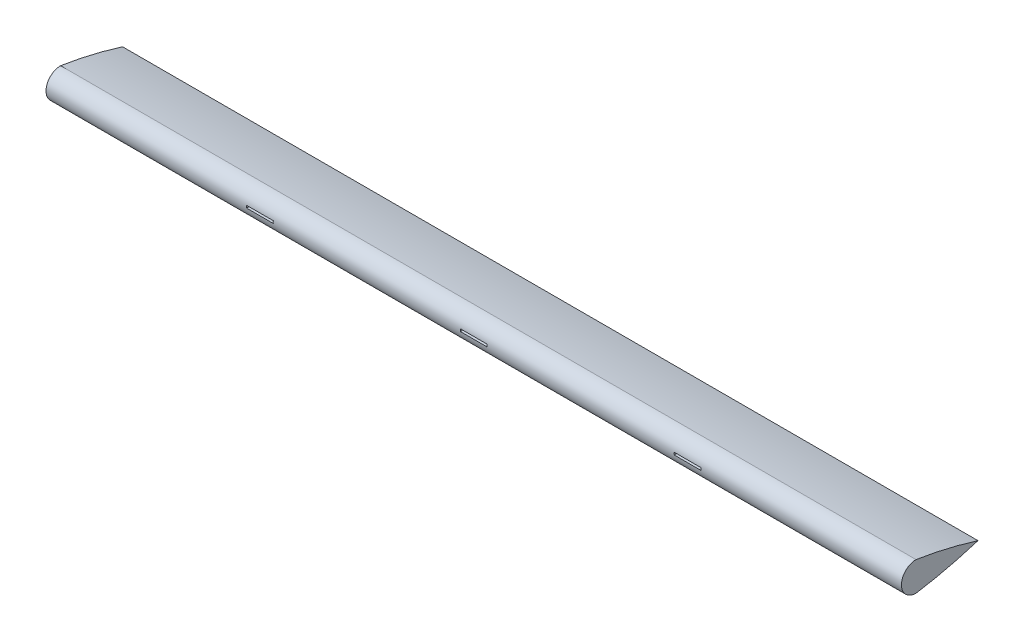
ISO-10303-21;
HEADER;
FILE_DESCRIPTION(('STEP AP214'),'2;1');
FILE_NAME('part.step','',(''),(''),'','','');
FILE_SCHEMA(('AUTOMOTIVE_DESIGN { 1 0 10303 214 1 1 1 1 }'));
ENDSEC;
DATA;
#1=APPLICATION_CONTEXT('core data for automotive mechanical design processes');
#2=APPLICATION_PROTOCOL_DEFINITION('international standard','automotive_design',2000,#1);
#3=PRODUCT_CONTEXT('',#1,'mechanical');
#4=PRODUCT('Part','Part','',(#3));
#5=PRODUCT_RELATED_PRODUCT_CATEGORY('part','',(#4));
#6=PRODUCT_DEFINITION_FORMATION('','',#4);
#7=PRODUCT_DEFINITION_CONTEXT('part definition',#1,'design');
#8=PRODUCT_DEFINITION('design','',#6,#7);
#9=PRODUCT_DEFINITION_SHAPE('','',#8);
#10=(LENGTH_UNIT() NAMED_UNIT(*) SI_UNIT(.MILLI.,.METRE.));
#11=(NAMED_UNIT(*) PLANE_ANGLE_UNIT() SI_UNIT($,.RADIAN.));
#12=(NAMED_UNIT(*) SI_UNIT($,.STERADIAN.) SOLID_ANGLE_UNIT());
#13=UNCERTAINTY_MEASURE_WITH_UNIT(LENGTH_MEASURE(1.E-05),#10,'distance_accuracy_value','');
#14=(GEOMETRIC_REPRESENTATION_CONTEXT(3) GLOBAL_UNCERTAINTY_ASSIGNED_CONTEXT((#13)) GLOBAL_UNIT_ASSIGNED_CONTEXT((#10,
#11,#12)) REPRESENTATION_CONTEXT('',''));
#15=CARTESIAN_POINT('',(0.,0.,0.));
#16=DIRECTION('',(0.,0.,1.));
#17=DIRECTION('',(1.,0.,0.));
#18=AXIS2_PLACEMENT_3D('',#15,#16,#17);
#19=CARTESIAN_POINT('',(-192.917832605124,0.,-3.99999999999997));
#20=DIRECTION('',(1.,0.,0.));
#21=DIRECTION('',(0.,0.,-1.));
#22=AXIS2_PLACEMENT_3D('',#19,#20,#21);
#23=CYLINDRICAL_SURFACE('',#22,6.00000000003809);
#24=CARTESIAN_POINT('',(-5.50000000000001,0.,-3.99999999999997));
#25=DIRECTION('',(1.,0.,0.));
#26=DIRECTION('',(0.,0.,-1.));
#27=AXIS2_PLACEMENT_3D('',#24,#25,#26);
#28=CIRCLE('',#27,6.00000000003809);
#29=CARTESIAN_POINT('',(-5.50000000000001,0.500000000000088,1.97913037158894));
#30=VERTEX_POINT('',#29);
#31=CARTESIAN_POINT('',(-5.50000000000001,-0.499999999999912,1.97913037158895));
#32=VERTEX_POINT('',#31);
#33=EDGE_CURVE('E460',#30,#32,#28,.T.);
#34=ORIENTED_EDGE('',*,*,#33,.F.);
#35=DIRECTION('',(1.,0.,0.));
#36=VECTOR('',#35,1.);
#37=CARTESIAN_POINT('',(-192.917832605124,0.500000000000088,1.97913037158894));
#38=LINE('',#37,#36);
#39=CARTESIAN_POINT('',(5.50000000000001,0.500000000000088,1.97913037158894));
#40=VERTEX_POINT('',#39);
#41=EDGE_CURVE('E458',#40,#30,#38,.F.);
#42=ORIENTED_EDGE('',*,*,#41,.F.);
#43=CARTESIAN_POINT('',(5.50000000000001,0.,-3.99999999999997));
#44=DIRECTION('',(-1.,0.,0.));
#45=DIRECTION('',(0.,0.,1.));
#46=AXIS2_PLACEMENT_3D('',#43,#44,#45);
#47=CIRCLE('',#46,6.00000000003809);
#48=CARTESIAN_POINT('',(5.50000000000001,-0.499999999999912,1.97913037158895));
#49=VERTEX_POINT('',#48);
#50=EDGE_CURVE('E456',#49,#40,#47,.T.);
#51=ORIENTED_EDGE('',*,*,#50,.F.);
#52=DIRECTION('',(1.,0.,0.));
#53=VECTOR('',#52,1.);
#54=CARTESIAN_POINT('',(-192.917832605124,-0.499999999999912,1.97913037158895));
#55=LINE('',#54,#53);
#56=EDGE_CURVE('E454',#32,#49,#55,.T.);
#57=ORIENTED_EDGE('',*,*,#56,.F.);
#58=EDGE_LOOP('',(#34,#42,#51,#57));
#59=FACE_BOUND('',#58,.T.);
#60=CARTESIAN_POINT('',(-176.,0.,-3.99999999999997));
#61=DIRECTION('',(1.,0.,0.));
#62=DIRECTION('',(0.,0.,-1.));
#63=AXIS2_PLACEMENT_3D('',#60,#61,#62);
#64=CIRCLE('',#63,6.00000000003809);
#65=CARTESIAN_POINT('',(-176.,6.00000000003808,-3.99999999975619));
#66=VERTEX_POINT('',#65);
#67=CARTESIAN_POINT('',(-176.,-6.00000000003742,-4.00000000000222));
#68=VERTEX_POINT('',#67);
#69=EDGE_CURVE('E214',#66,#68,#64,.T.);
#70=ORIENTED_EDGE('',*,*,#69,.T.);
#71=DIRECTION('',(1.,0.,0.));
#72=VECTOR('',#71,1.);
#73=CARTESIAN_POINT('',(-192.917832605124,-6.00000000003809,-3.99999999999997));
#74=LINE('',#73,#72);
#75=CARTESIAN_POINT('',(176.,-6.00000000003809,-3.99999999999997));
#76=VERTEX_POINT('',#75);
#77=EDGE_CURVE('E170',#68,#76,#74,.T.);
#78=ORIENTED_EDGE('',*,*,#77,.T.);
#79=CARTESIAN_POINT('',(176.,0.,-3.99999999999997));
#80=DIRECTION('',(-1.,0.,0.));
#81=DIRECTION('',(0.,0.,-1.));
#82=AXIS2_PLACEMENT_3D('',#79,#80,#81);
#83=CIRCLE('',#82,6.00000000003809);
#84=CARTESIAN_POINT('',(176.,6.00000000003809,-3.99999999999997));
#85=VERTEX_POINT('',#84);
#86=EDGE_CURVE('E167',#76,#85,#83,.T.);
#87=ORIENTED_EDGE('',*,*,#86,.T.);
#88=DIRECTION('',(1.,0.,0.));
#89=VECTOR('',#88,1.);
#90=CARTESIAN_POINT('',(-192.917832605124,6.00000000003809,-3.99999999999997));
#91=LINE('',#90,#89);
#92=EDGE_CURVE('E216',#66,#85,#91,.T.);
#93=ORIENTED_EDGE('',*,*,#92,.F.);
#94=EDGE_LOOP('',(#70,#78,#87,#93));
#95=FACE_BOUND('',#94,.T.);
#96=CARTESIAN_POINT('',(-93.5,0.,-3.99999999999997));
#97=DIRECTION('',(1.,0.,0.));
#98=DIRECTION('',(0.,0.,-1.));
#99=AXIS2_PLACEMENT_3D('',#96,#97,#98);
#100=CIRCLE('',#99,6.00000000003809);
#101=CARTESIAN_POINT('',(-93.5,0.500000000000088,1.97913037158894));
#102=VERTEX_POINT('',#101);
#103=CARTESIAN_POINT('',(-93.5,-0.499999999999912,1.97913037158895));
#104=VERTEX_POINT('',#103);
#105=EDGE_CURVE('E451',#102,#104,#100,.T.);
#106=ORIENTED_EDGE('',*,*,#105,.F.);
#107=DIRECTION('',(1.,0.,0.));
#108=VECTOR('',#107,1.);
#109=CARTESIAN_POINT('',(-192.917832605124,0.500000000000088,1.97913037158894));
#110=LINE('',#109,#108);
#111=CARTESIAN_POINT('',(-82.5,0.500000000000088,1.97913037158894));
#112=VERTEX_POINT('',#111);
#113=EDGE_CURVE('E449',#112,#102,#110,.F.);
#114=ORIENTED_EDGE('',*,*,#113,.F.);
#115=CARTESIAN_POINT('',(-82.5,0.,-3.99999999999997));
#116=DIRECTION('',(-1.,0.,0.));
#117=DIRECTION('',(0.,0.,1.));
#118=AXIS2_PLACEMENT_3D('',#115,#116,#117);
#119=CIRCLE('',#118,6.00000000003809);
#120=CARTESIAN_POINT('',(-82.5,-0.499999999999912,1.97913037158895));
#121=VERTEX_POINT('',#120);
#122=EDGE_CURVE('E443',#121,#112,#119,.T.);
#123=ORIENTED_EDGE('',*,*,#122,.F.);
#124=DIRECTION('',(1.,0.,0.));
#125=VECTOR('',#124,1.);
#126=CARTESIAN_POINT('',(-192.917832605124,-0.499999999999912,1.97913037158895));
#127=LINE('',#126,#125);
#128=EDGE_CURVE('E441',#104,#121,#127,.T.);
#129=ORIENTED_EDGE('',*,*,#128,.F.);
#130=EDGE_LOOP('',(#106,#114,#123,#129));
#131=FACE_BOUND('',#130,.T.);
#132=CARTESIAN_POINT('',(82.5,0.,-3.99999999999997));
#133=DIRECTION('',(1.,0.,0.));
#134=DIRECTION('',(0.,0.,-1.));
#135=AXIS2_PLACEMENT_3D('',#132,#133,#134);
#136=CIRCLE('',#135,6.00000000003809);
#137=CARTESIAN_POINT('',(82.5,0.500000000000088,1.97913037158894));
#138=VERTEX_POINT('',#137);
#139=CARTESIAN_POINT('',(82.5,-0.499999999999912,1.97913037158895));
#140=VERTEX_POINT('',#139);
#141=EDGE_CURVE('E11',#138,#140,#136,.T.);
#142=ORIENTED_EDGE('',*,*,#141,.F.);
#143=DIRECTION('',(1.,0.,0.));
#144=VECTOR('',#143,1.);
#145=CARTESIAN_POINT('',(-192.917832605124,0.500000000000088,1.97913037158894));
#146=LINE('',#145,#144);
#147=CARTESIAN_POINT('',(93.5,0.500000000000088,1.97913037158894));
#148=VERTEX_POINT('',#147);
#149=EDGE_CURVE('E49',#148,#138,#146,.F.);
#150=ORIENTED_EDGE('',*,*,#149,.F.);
#151=CARTESIAN_POINT('',(93.5,0.,-3.99999999999997));
#152=DIRECTION('',(-1.,0.,0.));
#153=DIRECTION('',(0.,0.,1.));
#154=AXIS2_PLACEMENT_3D('',#151,#152,#153);
#155=CIRCLE('',#154,6.00000000003809);
#156=CARTESIAN_POINT('',(93.5,-0.499999999999912,1.97913037158895));
#157=VERTEX_POINT('',#156);
#158=EDGE_CURVE('E464',#157,#148,#155,.T.);
#159=ORIENTED_EDGE('',*,*,#158,.F.);
#160=DIRECTION('',(1.,0.,0.));
#161=VECTOR('',#160,1.);
#162=CARTESIAN_POINT('',(-192.917832605124,-0.499999999999912,1.97913037158895));
#163=LINE('',#162,#161);
#164=EDGE_CURVE('E462',#140,#157,#163,.T.);
#165=ORIENTED_EDGE('',*,*,#164,.F.);
#166=EDGE_LOOP('',(#142,#150,#159,#165));
#167=FACE_BOUND('',#166,.T.);
#168=ADVANCED_FACE('F40',(#59,#95,#131,#167),#23,.T.);
#169=CARTESIAN_POINT('',(-176.,5.99999999999984,-3.99999999999997));
#170=DIRECTION('',(1.,0.,0.));
#171=DIRECTION('',(0.,0.,-1.));
#172=AXIS2_PLACEMENT_3D('',#169,#170,#171);
#173=PLANE('',#172);
#174=CARTESIAN_POINT('',(-176.,-8.,21.5000000000001));
#175=CARTESIAN_POINT('',(-176.,-7.99999999999967,-3.99999999999997));
#176=CARTESIAN_POINT('',(-176.,0.,-29.5));
#177=B_SPLINE_CURVE_WITH_KNOTS('',2,(#174,#175,#176),.UNSPECIFIED.,.F.,.F.,(3,3),(0.,1.),.UNSPECIFIED.);
#178=CARTESIAN_POINT('',(-176.,0.,-29.5));
#179=VERTEX_POINT('',#178);
#180=EDGE_CURVE('E227',#68,#179,#177,.T.);
#181=ORIENTED_EDGE('',*,*,#180,.F.);
#182=ORIENTED_EDGE('',*,*,#69,.F.);
#183=CARTESIAN_POINT('',(-176.,8.,21.5000000000001));
#184=CARTESIAN_POINT('',(-176.,7.99999999999967,-3.99999999999997));
#185=CARTESIAN_POINT('',(-176.,0.,-29.5));
#186=B_SPLINE_CURVE_WITH_KNOTS('',2,(#183,#184,#185),.UNSPECIFIED.,.F.,.F.,(3,3),(0.,1.),.UNSPECIFIED.);
#187=EDGE_CURVE('E215',#66,#179,#186,.T.);
#188=ORIENTED_EDGE('',*,*,#187,.T.);
#189=EDGE_LOOP('',(#181,#182,#188));
#190=FACE_BOUND('',#189,.T.);
#191=ADVANCED_FACE('F247',(#190),#173,.F.);
#192=CARTESIAN_POINT('',(176.,5.99999999999984,-3.99999999999997));
#193=DIRECTION('',(1.,0.,0.));
#194=DIRECTION('',(0.,0.,-1.));
#195=AXIS2_PLACEMENT_3D('',#192,#193,#194);
#196=PLANE('',#195);
#197=ORIENTED_EDGE('',*,*,#86,.F.);
#198=CARTESIAN_POINT('',(176.,-8.,21.5000000000001));
#199=CARTESIAN_POINT('',(176.,-7.99999999999967,-3.99999999999997));
#200=CARTESIAN_POINT('',(176.,0.,-29.5));
#201=B_SPLINE_CURVE_WITH_KNOTS('',2,(#198,#199,#200),.UNSPECIFIED.,.F.,.F.,(3,3),(0.,1.),.UNSPECIFIED.);
#202=CARTESIAN_POINT('',(176.,0.,-29.5));
#203=VERTEX_POINT('',#202);
#204=EDGE_CURVE('E226',#76,#203,#201,.T.);
#205=ORIENTED_EDGE('',*,*,#204,.T.);
#206=CARTESIAN_POINT('',(176.,8.,21.5000000000001));
#207=CARTESIAN_POINT('',(176.,7.99999999999967,-3.99999999999997));
#208=CARTESIAN_POINT('',(176.,0.,-29.5));
#209=B_SPLINE_CURVE_WITH_KNOTS('',2,(#206,#207,#208),.UNSPECIFIED.,.F.,.F.,(3,3),(0.,1.),.UNSPECIFIED.);
#210=EDGE_CURVE('E220',#85,#203,#209,.T.);
#211=ORIENTED_EDGE('',*,*,#210,.F.);
#212=EDGE_LOOP('',(#197,#205,#211));
#213=FACE_BOUND('',#212,.T.);
#214=ADVANCED_FACE('F245',(#213),#196,.T.);
#215=DIRECTION('',(-1.,0.,0.));
#216=VECTOR('',#215,1.);
#217=SURFACE_OF_LINEAR_EXTRUSION('',#201,#216);
#218=ORIENTED_EDGE('',*,*,#204,.F.);
#219=ORIENTED_EDGE('',*,*,#77,.F.);
#220=ORIENTED_EDGE('',*,*,#180,.T.);
#221=DIRECTION('',(-1.,0.,0.));
#222=VECTOR('',#221,1.);
#223=CARTESIAN_POINT('',(176.,0.,-29.5));
#224=LINE('',#223,#222);
#225=EDGE_CURVE('E235',#203,#179,#224,.T.);
#226=ORIENTED_EDGE('',*,*,#225,.F.);
#227=EDGE_LOOP('',(#218,#219,#220,#226));
#228=FACE_BOUND('',#227,.T.);
#229=ADVANCED_FACE('F242',(#228),#217,.F.);
#230=DIRECTION('',(-1.,0.,0.));
#231=VECTOR('',#230,1.);
#232=SURFACE_OF_LINEAR_EXTRUSION('',#209,#231);
#233=ORIENTED_EDGE('',*,*,#92,.T.);
#234=ORIENTED_EDGE('',*,*,#210,.T.);
#235=ORIENTED_EDGE('',*,*,#225,.T.);
#236=ORIENTED_EDGE('',*,*,#187,.F.);
#237=EDGE_LOOP('',(#233,#234,#235,#236));
#238=FACE_BOUND('',#237,.T.);
#239=ADVANCED_FACE('F42',(#238),#232,.T.);
#240=CARTESIAN_POINT('',(-93.5,-0.500000000000355,-7.99999999996252));
#241=DIRECTION('',(1.,0.,0.));
#242=DIRECTION('',(0.,0.,-1.));
#243=AXIS2_PLACEMENT_3D('',#240,#241,#242);
#244=PLANE('',#243);
#245=ORIENTED_EDGE('',*,*,#105,.T.);
#246=DIRECTION('',(0.,0.,1.));
#247=VECTOR('',#246,1.);
#248=CARTESIAN_POINT('',(-93.5,-0.500000000000355,-7.99999999996252));
#249=LINE('',#248,#247);
#250=CARTESIAN_POINT('',(-93.5,-0.500000000000355,-7.99999999996252));
#251=VERTEX_POINT('',#250);
#252=EDGE_CURVE('E204',#251,#104,#249,.T.);
#253=ORIENTED_EDGE('',*,*,#252,.F.);
#254=DIRECTION('',(0.,1.,0.));
#255=VECTOR('',#254,1.);
#256=CARTESIAN_POINT('',(-93.5,-0.500000000000355,-7.99999999996252));
#257=LINE('',#256,#255);
#258=CARTESIAN_POINT('',(-93.5,0.499999999999645,-7.99999999996257));
#259=VERTEX_POINT('',#258);
#260=EDGE_CURVE('E180',#251,#259,#257,.T.);
#261=ORIENTED_EDGE('',*,*,#260,.T.);
#262=DIRECTION('',(0.,0.,1.));
#263=VECTOR('',#262,1.);
#264=CARTESIAN_POINT('',(-93.5,0.499999999999645,-7.99999999996257));
#265=LINE('',#264,#263);
#266=EDGE_CURVE('E195',#259,#102,#265,.T.);
#267=ORIENTED_EDGE('',*,*,#266,.T.);
#268=EDGE_LOOP('',(#245,#253,#261,#267));
#269=FACE_BOUND('',#268,.T.);
#270=ADVANCED_FACE('F273',(#269),#244,.T.);
#271=CARTESIAN_POINT('',(-82.5,0.499999999999645,-7.99999999996257));
#272=DIRECTION('',(0.,-1.,0.));
#273=DIRECTION('',(0.,0.,-1.));
#274=AXIS2_PLACEMENT_3D('',#271,#272,#273);
#275=PLANE('',#274);
#276=ORIENTED_EDGE('',*,*,#113,.T.);
#277=ORIENTED_EDGE('',*,*,#266,.F.);
#278=DIRECTION('',(1.,0.,0.));
#279=VECTOR('',#278,1.);
#280=CARTESIAN_POINT('',(-82.5,0.499999999999645,-7.99999999996257));
#281=LINE('',#280,#279);
#282=CARTESIAN_POINT('',(-82.5,0.499999999999645,-7.99999999996257));
#283=VERTEX_POINT('',#282);
#284=EDGE_CURVE('E210',#259,#283,#281,.T.);
#285=ORIENTED_EDGE('',*,*,#284,.T.);
#286=DIRECTION('',(0.,0.,1.));
#287=VECTOR('',#286,1.);
#288=CARTESIAN_POINT('',(-82.5,0.499999999999645,-7.99999999996257));
#289=LINE('',#288,#287);
#290=EDGE_CURVE('E198',#283,#112,#289,.T.);
#291=ORIENTED_EDGE('',*,*,#290,.T.);
#292=EDGE_LOOP('',(#276,#277,#285,#291));
#293=FACE_BOUND('',#292,.T.);
#294=ADVANCED_FACE('F269',(#293),#275,.T.);
#295=CARTESIAN_POINT('',(-82.5,-0.500000000000355,-7.99999999996252));
#296=DIRECTION('',(-1.,0.,0.));
#297=DIRECTION('',(0.,0.,1.));
#298=AXIS2_PLACEMENT_3D('',#295,#296,#297);
#299=PLANE('',#298);
#300=ORIENTED_EDGE('',*,*,#122,.T.);
#301=ORIENTED_EDGE('',*,*,#290,.F.);
#302=DIRECTION('',(0.,-1.,0.));
#303=VECTOR('',#302,1.);
#304=CARTESIAN_POINT('',(-82.5,-0.500000000000355,-7.99999999996252));
#305=LINE('',#304,#303);
#306=CARTESIAN_POINT('',(-82.5,-0.500000000000355,-7.99999999996252));
#307=VERTEX_POINT('',#306);
#308=EDGE_CURVE('E208',#283,#307,#305,.T.);
#309=ORIENTED_EDGE('',*,*,#308,.T.);
#310=DIRECTION('',(0.,0.,1.));
#311=VECTOR('',#310,1.);
#312=CARTESIAN_POINT('',(-82.5,-0.500000000000355,-7.99999999996252));
#313=LINE('',#312,#311);
#314=EDGE_CURVE('E201',#307,#121,#313,.T.);
#315=ORIENTED_EDGE('',*,*,#314,.T.);
#316=EDGE_LOOP('',(#300,#301,#309,#315));
#317=FACE_BOUND('',#316,.T.);
#318=ADVANCED_FACE('F265',(#317),#299,.T.);
#319=CARTESIAN_POINT('',(-82.5,-0.500000000000355,-7.99999999996252));
#320=DIRECTION('',(0.,1.,0.));
#321=DIRECTION('',(0.,0.,1.));
#322=AXIS2_PLACEMENT_3D('',#319,#320,#321);
#323=PLANE('',#322);
#324=ORIENTED_EDGE('',*,*,#128,.T.);
#325=ORIENTED_EDGE('',*,*,#314,.F.);
#326=DIRECTION('',(-1.,0.,0.));
#327=VECTOR('',#326,1.);
#328=CARTESIAN_POINT('',(-82.5,-0.500000000000355,-7.99999999996252));
#329=LINE('',#328,#327);
#330=EDGE_CURVE('E206',#307,#251,#329,.T.);
#331=ORIENTED_EDGE('',*,*,#330,.T.);
#332=ORIENTED_EDGE('',*,*,#252,.T.);
#333=EDGE_LOOP('',(#324,#325,#331,#332));
#334=FACE_BOUND('',#333,.T.);
#335=ADVANCED_FACE('F261',(#334),#323,.T.);
#336=CARTESIAN_POINT('',(0.,-3.51445129365086E-13,-7.99999999996254));
#337=DIRECTION('',(0.,0.,1.));
#338=DIRECTION('',(0.,-1.,0.));
#339=AXIS2_PLACEMENT_3D('',#336,#337,#338);
#340=PLANE('',#339);
#341=ORIENTED_EDGE('',*,*,#260,.F.);
#342=ORIENTED_EDGE('',*,*,#330,.F.);
#343=ORIENTED_EDGE('',*,*,#308,.F.);
#344=ORIENTED_EDGE('',*,*,#284,.F.);
#345=EDGE_LOOP('',(#341,#342,#343,#344));
#346=FACE_BOUND('',#345,.T.);
#347=ADVANCED_FACE('F257',(#346),#340,.T.);
#348=CARTESIAN_POINT('',(-5.50000000000001,-0.500000000000355,-7.99999999996252));
#349=DIRECTION('',(1.,0.,0.));
#350=DIRECTION('',(0.,0.,-1.));
#351=AXIS2_PLACEMENT_3D('',#348,#349,#350);
#352=PLANE('',#351);
#353=ORIENTED_EDGE('',*,*,#33,.T.);
#354=DIRECTION('',(0.,0.,1.));
#355=VECTOR('',#354,1.);
#356=CARTESIAN_POINT('',(-5.50000000000001,-0.500000000000355,-7.99999999996252));
#357=LINE('',#356,#355);
#358=CARTESIAN_POINT('',(-5.50000000000001,-0.500000000000355,-7.99999999996252));
#359=VERTEX_POINT('',#358);
#360=EDGE_CURVE('E63',#359,#32,#357,.T.);
#361=ORIENTED_EDGE('',*,*,#360,.F.);
#362=DIRECTION('',(0.,1.,0.));
#363=VECTOR('',#362,1.);
#364=CARTESIAN_POINT('',(-5.50000000000001,-0.500000000000355,-7.99999999996252));
#365=LINE('',#364,#363);
#366=CARTESIAN_POINT('',(-5.50000000000001,0.499999999999645,-7.99999999996257));
#367=VERTEX_POINT('',#366);
#368=EDGE_CURVE('E163',#359,#367,#365,.T.);
#369=ORIENTED_EDGE('',*,*,#368,.T.);
#370=DIRECTION('',(0.,0.,1.));
#371=VECTOR('',#370,1.);
#372=CARTESIAN_POINT('',(-5.50000000000001,0.499999999999645,-7.99999999996257));
#373=LINE('',#372,#371);
#374=EDGE_CURVE('E176',#367,#30,#373,.T.);
#375=ORIENTED_EDGE('',*,*,#374,.T.);
#376=EDGE_LOOP('',(#353,#361,#369,#375));
#377=FACE_BOUND('',#376,.T.);
#378=ADVANCED_FACE('F260',(#377),#352,.T.);
#379=CARTESIAN_POINT('',(5.50000000000001,0.499999999999645,-7.99999999996257));
#380=DIRECTION('',(0.,-1.,0.));
#381=DIRECTION('',(0.,0.,-1.));
#382=AXIS2_PLACEMENT_3D('',#379,#380,#381);
#383=PLANE('',#382);
#384=ORIENTED_EDGE('',*,*,#41,.T.);
#385=ORIENTED_EDGE('',*,*,#374,.F.);
#386=DIRECTION('',(1.,0.,0.));
#387=VECTOR('',#386,1.);
#388=CARTESIAN_POINT('',(5.50000000000001,0.499999999999645,-7.99999999996257));
#389=LINE('',#388,#387);
#390=CARTESIAN_POINT('',(5.50000000000001,0.499999999999645,-7.99999999996257));
#391=VERTEX_POINT('',#390);
#392=EDGE_CURVE('E191',#367,#391,#389,.T.);
#393=ORIENTED_EDGE('',*,*,#392,.T.);
#394=DIRECTION('',(0.,0.,1.));
#395=VECTOR('',#394,1.);
#396=CARTESIAN_POINT('',(5.50000000000001,0.499999999999645,-7.99999999996257));
#397=LINE('',#396,#395);
#398=EDGE_CURVE('E179',#391,#40,#397,.T.);
#399=ORIENTED_EDGE('',*,*,#398,.T.);
#400=EDGE_LOOP('',(#384,#385,#393,#399));
#401=FACE_BOUND('',#400,.T.);
#402=ADVANCED_FACE('F288',(#401),#383,.T.);
#403=CARTESIAN_POINT('',(5.50000000000001,-0.500000000000355,-7.99999999996252));
#404=DIRECTION('',(-1.,0.,0.));
#405=DIRECTION('',(0.,0.,1.));
#406=AXIS2_PLACEMENT_3D('',#403,#404,#405);
#407=PLANE('',#406);
#408=ORIENTED_EDGE('',*,*,#50,.T.);
#409=ORIENTED_EDGE('',*,*,#398,.F.);
#410=DIRECTION('',(0.,-1.,0.));
#411=VECTOR('',#410,1.);
#412=CARTESIAN_POINT('',(5.50000000000001,-0.500000000000355,-7.99999999996252));
#413=LINE('',#412,#411);
#414=CARTESIAN_POINT('',(5.50000000000001,-0.500000000000355,-7.99999999996252));
#415=VERTEX_POINT('',#414);
#416=EDGE_CURVE('E189',#391,#415,#413,.T.);
#417=ORIENTED_EDGE('',*,*,#416,.T.);
#418=DIRECTION('',(0.,0.,1.));
#419=VECTOR('',#418,1.);
#420=CARTESIAN_POINT('',(5.50000000000001,-0.500000000000355,-7.99999999996252));
#421=LINE('',#420,#419);
#422=EDGE_CURVE('E183',#415,#49,#421,.T.);
#423=ORIENTED_EDGE('',*,*,#422,.T.);
#424=EDGE_LOOP('',(#408,#409,#417,#423));
#425=FACE_BOUND('',#424,.T.);
#426=ADVANCED_FACE('F285',(#425),#407,.T.);
#427=CARTESIAN_POINT('',(5.50000000000001,-0.500000000000355,-7.99999999996252));
#428=DIRECTION('',(0.,1.,0.));
#429=DIRECTION('',(0.,0.,1.));
#430=AXIS2_PLACEMENT_3D('',#427,#428,#429);
#431=PLANE('',#430);
#432=ORIENTED_EDGE('',*,*,#56,.T.);
#433=ORIENTED_EDGE('',*,*,#422,.F.);
#434=DIRECTION('',(-1.,0.,0.));
#435=VECTOR('',#434,1.);
#436=CARTESIAN_POINT('',(5.50000000000001,-0.500000000000355,-7.99999999996252));
#437=LINE('',#436,#435);
#438=EDGE_CURVE('E187',#415,#359,#437,.T.);
#439=ORIENTED_EDGE('',*,*,#438,.T.);
#440=ORIENTED_EDGE('',*,*,#360,.T.);
#441=EDGE_LOOP('',(#432,#433,#439,#440));
#442=FACE_BOUND('',#441,.T.);
#443=ADVANCED_FACE('F281',(#442),#431,.T.);
#444=CARTESIAN_POINT('',(0.,-3.51445129365086E-13,-7.99999999996254));
#445=DIRECTION('',(0.,0.,1.));
#446=DIRECTION('',(0.,-1.,0.));
#447=AXIS2_PLACEMENT_3D('',#444,#445,#446);
#448=PLANE('',#447);
#449=ORIENTED_EDGE('',*,*,#368,.F.);
#450=ORIENTED_EDGE('',*,*,#438,.F.);
#451=ORIENTED_EDGE('',*,*,#416,.F.);
#452=ORIENTED_EDGE('',*,*,#392,.F.);
#453=EDGE_LOOP('',(#449,#450,#451,#452));
#454=FACE_BOUND('',#453,.T.);
#455=ADVANCED_FACE('F278',(#454),#448,.T.);
#456=CARTESIAN_POINT('',(82.5,-0.500000000000355,-7.99999999996252));
#457=DIRECTION('',(1.,0.,0.));
#458=DIRECTION('',(0.,0.,-1.));
#459=AXIS2_PLACEMENT_3D('',#456,#457,#458);
#460=PLANE('',#459);
#461=ORIENTED_EDGE('',*,*,#141,.T.);
#462=DIRECTION('',(0.,0.,1.));
#463=VECTOR('',#462,1.);
#464=CARTESIAN_POINT('',(82.5,-0.500000000000355,-7.99999999996252));
#465=LINE('',#464,#463);
#466=CARTESIAN_POINT('',(82.5,-0.500000000000355,-7.99999999996252));
#467=VERTEX_POINT('',#466);
#468=EDGE_CURVE('E56',#467,#140,#465,.T.);
#469=ORIENTED_EDGE('',*,*,#468,.F.);
#470=DIRECTION('',(0.,1.,0.));
#471=VECTOR('',#470,1.);
#472=CARTESIAN_POINT('',(82.5,-0.500000000000355,-7.99999999996252));
#473=LINE('',#472,#471);
#474=CARTESIAN_POINT('',(82.5,0.499999999999645,-7.99999999996257));
#475=VERTEX_POINT('',#474);
#476=EDGE_CURVE('E151',#467,#475,#473,.T.);
#477=ORIENTED_EDGE('',*,*,#476,.T.);
#478=DIRECTION('',(0.,0.,1.));
#479=VECTOR('',#478,1.);
#480=CARTESIAN_POINT('',(82.5,0.499999999999645,-7.99999999996257));
#481=LINE('',#480,#479);
#482=EDGE_CURVE('E161',#475,#138,#481,.T.);
#483=ORIENTED_EDGE('',*,*,#482,.T.);
#484=EDGE_LOOP('',(#461,#469,#477,#483));
#485=FACE_BOUND('',#484,.T.);
#486=ADVANCED_FACE('F160',(#485),#460,.T.);
#487=CARTESIAN_POINT('',(93.5,0.499999999999645,-7.99999999996257));
#488=DIRECTION('',(0.,-1.,0.));
#489=DIRECTION('',(0.,0.,-1.));
#490=AXIS2_PLACEMENT_3D('',#487,#488,#489);
#491=PLANE('',#490);
#492=ORIENTED_EDGE('',*,*,#149,.T.);
#493=ORIENTED_EDGE('',*,*,#482,.F.);
#494=DIRECTION('',(1.,0.,0.));
#495=VECTOR('',#494,1.);
#496=CARTESIAN_POINT('',(93.5,0.499999999999645,-7.99999999996257));
#497=LINE('',#496,#495);
#498=CARTESIAN_POINT('',(93.5,0.499999999999645,-7.99999999996257));
#499=VERTEX_POINT('',#498);
#500=EDGE_CURVE('E147',#475,#499,#497,.T.);
#501=ORIENTED_EDGE('',*,*,#500,.T.);
#502=DIRECTION('',(0.,0.,1.));
#503=VECTOR('',#502,1.);
#504=CARTESIAN_POINT('',(93.5,0.499999999999645,-7.99999999996257));
#505=LINE('',#504,#503);
#506=EDGE_CURVE('E168',#499,#148,#505,.T.);
#507=ORIENTED_EDGE('',*,*,#506,.T.);
#508=EDGE_LOOP('',(#492,#493,#501,#507));
#509=FACE_BOUND('',#508,.T.);
#510=ADVANCED_FACE('F165',(#509),#491,.T.);
#511=CARTESIAN_POINT('',(93.5,-0.500000000000355,-7.99999999996252));
#512=DIRECTION('',(-1.,0.,0.));
#513=DIRECTION('',(0.,0.,1.));
#514=AXIS2_PLACEMENT_3D('',#511,#512,#513);
#515=PLANE('',#514);
#516=ORIENTED_EDGE('',*,*,#158,.T.);
#517=ORIENTED_EDGE('',*,*,#506,.F.);
#518=DIRECTION('',(0.,-1.,0.));
#519=VECTOR('',#518,1.);
#520=CARTESIAN_POINT('',(93.5,-0.500000000000355,-7.99999999996252));
#521=LINE('',#520,#519);
#522=CARTESIAN_POINT('',(93.5,-0.500000000000355,-7.99999999996252));
#523=VERTEX_POINT('',#522);
#524=EDGE_CURVE('E152',#499,#523,#521,.T.);
#525=ORIENTED_EDGE('',*,*,#524,.T.);
#526=DIRECTION('',(0.,0.,1.));
#527=VECTOR('',#526,1.);
#528=CARTESIAN_POINT('',(93.5,-0.500000000000355,-7.99999999996252));
#529=LINE('',#528,#527);
#530=EDGE_CURVE('E172',#523,#157,#529,.T.);
#531=ORIENTED_EDGE('',*,*,#530,.T.);
#532=EDGE_LOOP('',(#516,#517,#525,#531));
#533=FACE_BOUND('',#532,.T.);
#534=ADVANCED_FACE('F300',(#533),#515,.T.);
#535=CARTESIAN_POINT('',(93.5,-0.500000000000355,-7.99999999996252));
#536=DIRECTION('',(0.,1.,0.));
#537=DIRECTION('',(0.,0.,1.));
#538=AXIS2_PLACEMENT_3D('',#535,#536,#537);
#539=PLANE('',#538);
#540=ORIENTED_EDGE('',*,*,#164,.T.);
#541=ORIENTED_EDGE('',*,*,#530,.F.);
#542=DIRECTION('',(-1.,0.,0.));
#543=VECTOR('',#542,1.);
#544=CARTESIAN_POINT('',(93.5,-0.500000000000355,-7.99999999996252));
#545=LINE('',#544,#543);
#546=EDGE_CURVE('E470',#523,#467,#545,.T.);
#547=ORIENTED_EDGE('',*,*,#546,.T.);
#548=ORIENTED_EDGE('',*,*,#468,.T.);
#549=EDGE_LOOP('',(#540,#541,#547,#548));
#550=FACE_BOUND('',#549,.T.);
#551=ADVANCED_FACE('F303',(#550),#539,.T.);
#552=CARTESIAN_POINT('',(0.,-3.51445129365086E-13,-7.99999999996254));
#553=DIRECTION('',(0.,0.,1.));
#554=DIRECTION('',(0.,-1.,0.));
#555=AXIS2_PLACEMENT_3D('',#552,#553,#554);
#556=PLANE('',#555);
#557=ORIENTED_EDGE('',*,*,#476,.F.);
#558=ORIENTED_EDGE('',*,*,#546,.F.);
#559=ORIENTED_EDGE('',*,*,#524,.F.);
#560=ORIENTED_EDGE('',*,*,#500,.F.);
#561=EDGE_LOOP('',(#557,#558,#559,#560));
#562=FACE_BOUND('',#561,.T.);
#563=ADVANCED_FACE('F149',(#562),#556,.T.);
#564=CLOSED_SHELL('',(#168,#191,#214,#229,#239,#270,#294,#318,#335,#347,#378,#402,#426,#443,
#455,#486,#510,#534,#551,#563));
#565=MANIFOLD_SOLID_BREP('B2',#564);
#566=ADVANCED_BREP_SHAPE_REPRESENTATION('',(#18,#565),#14);
#567=SHAPE_DEFINITION_REPRESENTATION(#9,#566);
ENDSEC;
END-ISO-10303-21;
